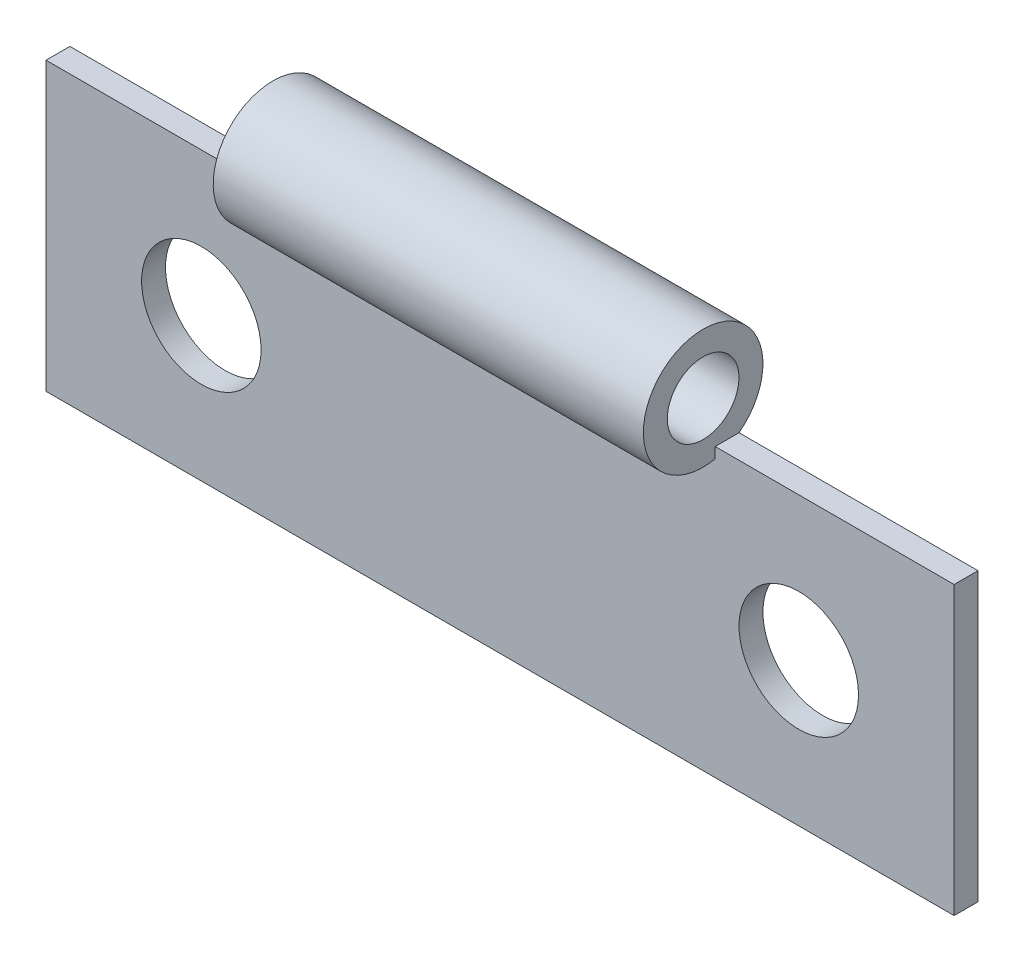
ISO-10303-21;
HEADER;
FILE_DESCRIPTION(('STEP AP214'),'2;1');
FILE_NAME('part.step','',(''),(''),'','','');
FILE_SCHEMA(('AUTOMOTIVE_DESIGN { 1 0 10303 214 1 1 1 1 }'));
ENDSEC;
DATA;
#1=APPLICATION_CONTEXT('core data for automotive mechanical design processes');
#2=APPLICATION_PROTOCOL_DEFINITION('international standard','automotive_design',2000,#1);
#3=PRODUCT_CONTEXT('',#1,'mechanical');
#4=PRODUCT('Part','Part','',(#3));
#5=PRODUCT_RELATED_PRODUCT_CATEGORY('part','',(#4));
#6=PRODUCT_DEFINITION_FORMATION('','',#4);
#7=PRODUCT_DEFINITION_CONTEXT('part definition',#1,'design');
#8=PRODUCT_DEFINITION('design','',#6,#7);
#9=PRODUCT_DEFINITION_SHAPE('','',#8);
#10=(LENGTH_UNIT() NAMED_UNIT(*) SI_UNIT(.MILLI.,.METRE.));
#11=(NAMED_UNIT(*) PLANE_ANGLE_UNIT() SI_UNIT($,.RADIAN.));
#12=(NAMED_UNIT(*) SI_UNIT($,.STERADIAN.) SOLID_ANGLE_UNIT());
#13=UNCERTAINTY_MEASURE_WITH_UNIT(LENGTH_MEASURE(1.E-05),#10,'distance_accuracy_value','');
#14=(GEOMETRIC_REPRESENTATION_CONTEXT(3) GLOBAL_UNCERTAINTY_ASSIGNED_CONTEXT((#13)) GLOBAL_UNIT_ASSIGNED_CONTEXT((#10,
#11,#12)) REPRESENTATION_CONTEXT('',''));
#15=CARTESIAN_POINT('',(0.,0.,0.));
#16=DIRECTION('',(0.,0.,1.));
#17=DIRECTION('',(1.,0.,0.));
#18=AXIS2_PLACEMENT_3D('',#15,#16,#17);
#19=CARTESIAN_POINT('',(0.,0.,1.));
#20=DIRECTION('',(0.,0.,-1.));
#21=DIRECTION('',(-1.,0.,0.));
#22=AXIS2_PLACEMENT_3D('',#19,#20,#21);
#23=PLANE('',#22);
#24=CARTESIAN_POINT('',(-12.5,0.,1.));
#25=DIRECTION('',(0.,0.,1.));
#26=DIRECTION('',(1.,0.,0.));
#27=AXIS2_PLACEMENT_3D('',#24,#25,#26);
#28=CIRCLE('',#27,2.5);
#29=CARTESIAN_POINT('',(-10.,0.,1.));
#30=VERTEX_POINT('',#29);
#31=EDGE_CURVE('E120',#30,#30,#28,.T.);
#32=ORIENTED_EDGE('',*,*,#31,.F.);
#33=EDGE_LOOP('',(#32));
#34=FACE_BOUND('',#33,.T.);
#35=CARTESIAN_POINT('',(12.5,0.,1.));
#36=DIRECTION('',(0.,0.,1.));
#37=DIRECTION('',(1.,0.,0.));
#38=AXIS2_PLACEMENT_3D('',#35,#36,#37);
#39=CIRCLE('',#38,2.5);
#40=CARTESIAN_POINT('',(15.,0.,1.));
#41=VERTEX_POINT('',#40);
#42=EDGE_CURVE('E127',#41,#41,#39,.T.);
#43=ORIENTED_EDGE('',*,*,#42,.F.);
#44=EDGE_LOOP('',(#43));
#45=FACE_BOUND('',#44,.T.);
#46=DIRECTION('',(0.,1.,0.));
#47=VECTOR('',#46,1.);
#48=CARTESIAN_POINT('',(9.,0.,1.));
#49=LINE('',#48,#47);
#50=CARTESIAN_POINT('',(9.,5.55084963734132,1.));
#51=VERTEX_POINT('',#50);
#52=CARTESIAN_POINT('',(9.,6.,1.));
#53=VERTEX_POINT('',#52);
#54=EDGE_CURVE('E105',#51,#53,#49,.T.);
#55=ORIENTED_EDGE('',*,*,#54,.F.);
#56=DIRECTION('',(-1.,0.,0.));
#57=VECTOR('',#56,1.);
#58=CARTESIAN_POINT('',(9.,5.55084963734132,1.));
#59=LINE('',#58,#57);
#60=CARTESIAN_POINT('',(-9.,5.55084963734132,1.));
#61=VERTEX_POINT('',#60);
#62=EDGE_CURVE('E111',#51,#61,#59,.T.);
#63=ORIENTED_EDGE('',*,*,#62,.T.);
#64=DIRECTION('',(0.,1.,0.));
#65=VECTOR('',#64,1.);
#66=CARTESIAN_POINT('',(-9.,0.,1.));
#67=LINE('',#66,#65);
#68=CARTESIAN_POINT('',(-9.,6.,1.));
#69=VERTEX_POINT('',#68);
#70=EDGE_CURVE('E99',#61,#69,#67,.T.);
#71=ORIENTED_EDGE('',*,*,#70,.T.);
#72=DIRECTION('',(-1.,0.,0.));
#73=VECTOR('',#72,1.);
#74=CARTESIAN_POINT('',(-19.,6.,1.));
#75=LINE('',#74,#73);
#76=CARTESIAN_POINT('',(-19.,6.,1.));
#77=VERTEX_POINT('',#76);
#78=EDGE_CURVE('E135',#69,#77,#75,.T.);
#79=ORIENTED_EDGE('',*,*,#78,.T.);
#80=DIRECTION('',(0.,-1.,0.));
#81=VECTOR('',#80,1.);
#82=CARTESIAN_POINT('',(-19.,-6.,1.));
#83=LINE('',#82,#81);
#84=CARTESIAN_POINT('',(-19.,-6.,1.));
#85=VERTEX_POINT('',#84);
#86=EDGE_CURVE('E137',#77,#85,#83,.T.);
#87=ORIENTED_EDGE('',*,*,#86,.T.);
#88=DIRECTION('',(1.,0.,0.));
#89=VECTOR('',#88,1.);
#90=CARTESIAN_POINT('',(-19.,-6.,1.));
#91=LINE('',#90,#89);
#92=CARTESIAN_POINT('',(19.,-6.,1.));
#93=VERTEX_POINT('',#92);
#94=EDGE_CURVE('E56',#85,#93,#91,.T.);
#95=ORIENTED_EDGE('',*,*,#94,.T.);
#96=DIRECTION('',(0.,1.,0.));
#97=VECTOR('',#96,1.);
#98=CARTESIAN_POINT('',(19.,-6.,1.));
#99=LINE('',#98,#97);
#100=CARTESIAN_POINT('',(19.,6.,1.));
#101=VERTEX_POINT('',#100);
#102=EDGE_CURVE('E133',#93,#101,#99,.T.);
#103=ORIENTED_EDGE('',*,*,#102,.T.);
#104=EDGE_CURVE('E85',#101,#53,#75,.T.);
#105=ORIENTED_EDGE('',*,*,#104,.T.);
#106=EDGE_LOOP('',(#55,#63,#71,#79,#87,#95,#103,#105));
#107=FACE_BOUND('',#106,.T.);
#108=ADVANCED_FACE('F32',(#34,#45,#107),#23,.F.);
#109=CARTESIAN_POINT('',(-19.,6.,1.));
#110=DIRECTION('',(0.,-1.,0.));
#111=DIRECTION('',(0.,0.,-1.));
#112=AXIS2_PLACEMENT_3D('',#109,#110,#111);
#113=PLANE('',#112);
#114=DIRECTION('',(0.,0.,-1.));
#115=VECTOR('',#114,1.);
#116=CARTESIAN_POINT('',(9.,6.,1.));
#117=LINE('',#116,#115);
#118=CARTESIAN_POINT('',(9.,6.,0.00123140658122851));
#119=VERTEX_POINT('',#118);
#120=EDGE_CURVE('E11',#53,#119,#117,.T.);
#121=ORIENTED_EDGE('',*,*,#120,.F.);
#122=ORIENTED_EDGE('',*,*,#104,.F.);
#123=DIRECTION('',(0.,0.,-1.));
#124=VECTOR('',#123,1.);
#125=CARTESIAN_POINT('',(19.,6.,1.));
#126=LINE('',#125,#124);
#127=CARTESIAN_POINT('',(19.,6.,0.));
#128=VERTEX_POINT('',#127);
#129=EDGE_CURVE('E154',#101,#128,#126,.T.);
#130=ORIENTED_EDGE('',*,*,#129,.T.);
#131=DIRECTION('',(-1.,0.,0.));
#132=VECTOR('',#131,1.);
#133=CARTESIAN_POINT('',(-19.,6.,0.));
#134=LINE('',#133,#132);
#135=CARTESIAN_POINT('',(-19.,6.,0.));
#136=VERTEX_POINT('',#135);
#137=EDGE_CURVE('E143',#128,#136,#134,.T.);
#138=ORIENTED_EDGE('',*,*,#137,.T.);
#139=DIRECTION('',(0.,0.,-1.));
#140=VECTOR('',#139,1.);
#141=CARTESIAN_POINT('',(-19.,6.,1.));
#142=LINE('',#141,#140);
#143=EDGE_CURVE('E151',#77,#136,#142,.T.);
#144=ORIENTED_EDGE('',*,*,#143,.F.);
#145=ORIENTED_EDGE('',*,*,#78,.F.);
#146=DIRECTION('',(0.,0.,-1.));
#147=VECTOR('',#146,1.);
#148=CARTESIAN_POINT('',(-9.,6.,1.));
#149=LINE('',#148,#147);
#150=CARTESIAN_POINT('',(-9.,6.,0.00123140658122851));
#151=VERTEX_POINT('',#150);
#152=EDGE_CURVE('E102',#69,#151,#149,.T.);
#153=ORIENTED_EDGE('',*,*,#152,.T.);
#154=DIRECTION('',(-1.,0.,0.));
#155=VECTOR('',#154,1.);
#156=CARTESIAN_POINT('',(9.,6.,0.00123140658122851));
#157=LINE('',#156,#155);
#158=EDGE_CURVE('E40',#151,#119,#157,.F.);
#159=ORIENTED_EDGE('',*,*,#158,.T.);
#160=EDGE_LOOP('',(#121,#122,#130,#138,#144,#145,#153,#159));
#161=FACE_BOUND('',#160,.T.);
#162=ADVANCED_FACE('F156',(#161),#113,.F.);
#163=CARTESIAN_POINT('',(0.,0.,0.));
#164=DIRECTION('',(0.,0.,-1.));
#165=DIRECTION('',(-1.,0.,0.));
#166=AXIS2_PLACEMENT_3D('',#163,#164,#165);
#167=PLANE('',#166);
#168=CARTESIAN_POINT('',(12.5,0.,0.));
#169=DIRECTION('',(0.,0.,1.));
#170=DIRECTION('',(1.,0.,0.));
#171=AXIS2_PLACEMENT_3D('',#168,#169,#170);
#172=CIRCLE('',#171,2.5);
#173=CARTESIAN_POINT('',(15.,0.,0.));
#174=VERTEX_POINT('',#173);
#175=EDGE_CURVE('E125',#174,#174,#172,.T.);
#176=ORIENTED_EDGE('',*,*,#175,.T.);
#177=EDGE_LOOP('',(#176));
#178=FACE_BOUND('',#177,.T.);
#179=DIRECTION('',(0.,1.,0.));
#180=VECTOR('',#179,1.);
#181=CARTESIAN_POINT('',(19.,-6.,0.));
#182=LINE('',#181,#180);
#183=CARTESIAN_POINT('',(19.,-6.,0.));
#184=VERTEX_POINT('',#183);
#185=EDGE_CURVE('E130',#184,#128,#182,.T.);
#186=ORIENTED_EDGE('',*,*,#185,.F.);
#187=DIRECTION('',(1.,0.,0.));
#188=VECTOR('',#187,1.);
#189=CARTESIAN_POINT('',(-19.,-6.,0.));
#190=LINE('',#189,#188);
#191=CARTESIAN_POINT('',(-19.,-6.,0.));
#192=VERTEX_POINT('',#191);
#193=EDGE_CURVE('E77',#192,#184,#190,.T.);
#194=ORIENTED_EDGE('',*,*,#193,.F.);
#195=DIRECTION('',(0.,-1.,0.));
#196=VECTOR('',#195,1.);
#197=CARTESIAN_POINT('',(-19.,-6.,0.));
#198=LINE('',#197,#196);
#199=EDGE_CURVE('E145',#136,#192,#198,.T.);
#200=ORIENTED_EDGE('',*,*,#199,.F.);
#201=ORIENTED_EDGE('',*,*,#137,.F.);
#202=EDGE_LOOP('',(#186,#194,#200,#201));
#203=FACE_BOUND('',#202,.T.);
#204=CARTESIAN_POINT('',(-12.5,0.,0.));
#205=DIRECTION('',(0.,0.,1.));
#206=DIRECTION('',(1.,0.,0.));
#207=AXIS2_PLACEMENT_3D('',#204,#205,#206);
#208=CIRCLE('',#207,2.5);
#209=CARTESIAN_POINT('',(-10.,0.,0.));
#210=VERTEX_POINT('',#209);
#211=EDGE_CURVE('E117',#210,#210,#208,.T.);
#212=ORIENTED_EDGE('',*,*,#211,.T.);
#213=EDGE_LOOP('',(#212));
#214=FACE_BOUND('',#213,.T.);
#215=ADVANCED_FACE('F169',(#178,#203,#214),#167,.T.);
#216=CARTESIAN_POINT('',(19.,-6.,1.));
#217=DIRECTION('',(-1.,0.,0.));
#218=DIRECTION('',(0.,0.,1.));
#219=AXIS2_PLACEMENT_3D('',#216,#217,#218);
#220=PLANE('',#219);
#221=ORIENTED_EDGE('',*,*,#185,.T.);
#222=ORIENTED_EDGE('',*,*,#129,.F.);
#223=ORIENTED_EDGE('',*,*,#102,.F.);
#224=DIRECTION('',(0.,0.,-1.));
#225=VECTOR('',#224,1.);
#226=CARTESIAN_POINT('',(19.,-6.,1.));
#227=LINE('',#226,#225);
#228=EDGE_CURVE('E140',#93,#184,#227,.T.);
#229=ORIENTED_EDGE('',*,*,#228,.T.);
#230=EDGE_LOOP('',(#221,#222,#223,#229));
#231=FACE_BOUND('',#230,.T.);
#232=ADVANCED_FACE('F34',(#231),#220,.F.);
#233=CARTESIAN_POINT('',(-19.,-6.,1.));
#234=DIRECTION('',(1.,0.,0.));
#235=DIRECTION('',(0.,0.,-1.));
#236=AXIS2_PLACEMENT_3D('',#233,#234,#235);
#237=PLANE('',#236);
#238=ORIENTED_EDGE('',*,*,#199,.T.);
#239=DIRECTION('',(0.,0.,-1.));
#240=VECTOR('',#239,1.);
#241=CARTESIAN_POINT('',(-19.,-6.,1.));
#242=LINE('',#241,#240);
#243=EDGE_CURVE('E149',#85,#192,#242,.T.);
#244=ORIENTED_EDGE('',*,*,#243,.F.);
#245=ORIENTED_EDGE('',*,*,#86,.F.);
#246=ORIENTED_EDGE('',*,*,#143,.T.);
#247=EDGE_LOOP('',(#238,#244,#245,#246));
#248=FACE_BOUND('',#247,.T.);
#249=ADVANCED_FACE('F161',(#248),#237,.F.);
#250=CARTESIAN_POINT('',(-19.,-6.,1.));
#251=DIRECTION('',(0.,1.,0.));
#252=DIRECTION('',(0.,0.,1.));
#253=AXIS2_PLACEMENT_3D('',#250,#251,#252);
#254=PLANE('',#253);
#255=ORIENTED_EDGE('',*,*,#193,.T.);
#256=ORIENTED_EDGE('',*,*,#228,.F.);
#257=ORIENTED_EDGE('',*,*,#94,.F.);
#258=ORIENTED_EDGE('',*,*,#243,.T.);
#259=EDGE_LOOP('',(#255,#256,#257,#258));
#260=FACE_BOUND('',#259,.T.);
#261=ADVANCED_FACE('F163',(#260),#254,.F.);
#262=CARTESIAN_POINT('',(12.5,0.,1.));
#263=DIRECTION('',(0.,0.,-1.));
#264=DIRECTION('',(-1.,0.,0.));
#265=AXIS2_PLACEMENT_3D('',#262,#263,#264);
#266=CYLINDRICAL_SURFACE('',#265,2.5);
#267=ORIENTED_EDGE('',*,*,#42,.T.);
#268=EDGE_LOOP('',(#267));
#269=FACE_BOUND('',#268,.T.);
#270=ORIENTED_EDGE('',*,*,#175,.F.);
#271=EDGE_LOOP('',(#270));
#272=FACE_BOUND('',#271,.T.);
#273=ADVANCED_FACE('F178',(#269,#272),#266,.F.);
#274=CARTESIAN_POINT('',(-12.5,0.,1.));
#275=DIRECTION('',(0.,0.,-1.));
#276=DIRECTION('',(-1.,0.,0.));
#277=AXIS2_PLACEMENT_3D('',#274,#275,#276);
#278=CYLINDRICAL_SURFACE('',#277,2.5);
#279=ORIENTED_EDGE('',*,*,#31,.T.);
#280=EDGE_LOOP('',(#279));
#281=FACE_BOUND('',#280,.T.);
#282=ORIENTED_EDGE('',*,*,#211,.F.);
#283=EDGE_LOOP('',(#282));
#284=FACE_BOUND('',#283,.T.);
#285=ADVANCED_FACE('F176',(#281,#284),#278,.F.);
#286=CARTESIAN_POINT('',(9.,8.00184692044318,1.50184692044318));
#287=DIRECTION('',(-1.,0.,0.));
#288=DIRECTION('',(0.,0.,1.));
#289=AXIS2_PLACEMENT_3D('',#286,#287,#288);
#290=CYLINDRICAL_SURFACE('',#289,2.50184692044318);
#291=ORIENTED_EDGE('',*,*,#62,.F.);
#292=CARTESIAN_POINT('',(9.,8.00184692044318,1.50184692044318));
#293=DIRECTION('',(-1.,0.,0.));
#294=DIRECTION('',(0.,0.,1.));
#295=AXIS2_PLACEMENT_3D('',#292,#293,#294);
#296=CIRCLE('',#295,2.50184692044318);
#297=EDGE_CURVE('E106',#51,#119,#296,.T.);
#298=ORIENTED_EDGE('',*,*,#297,.T.);
#299=ORIENTED_EDGE('',*,*,#158,.F.);
#300=CARTESIAN_POINT('',(-9.,8.00184692044318,1.50184692044318));
#301=DIRECTION('',(-1.,0.,0.));
#302=DIRECTION('',(0.,0.,1.));
#303=AXIS2_PLACEMENT_3D('',#300,#301,#302);
#304=CIRCLE('',#303,2.50184692044318);
#305=EDGE_CURVE('E47',#61,#151,#304,.T.);
#306=ORIENTED_EDGE('',*,*,#305,.F.);
#307=EDGE_LOOP('',(#291,#298,#299,#306));
#308=FACE_BOUND('',#307,.T.);
#309=ADVANCED_FACE('F109',(#308),#290,.T.);
#310=CARTESIAN_POINT('',(9.,8.00184692044318,1.50184692044318));
#311=DIRECTION('',(-1.,0.,0.));
#312=DIRECTION('',(0.,0.,1.));
#313=AXIS2_PLACEMENT_3D('',#310,#311,#312);
#314=PLANE('',#313);
#315=CARTESIAN_POINT('',(9.,8.00184692044318,1.50184692044318));
#316=DIRECTION('',(-1.,0.,0.));
#317=DIRECTION('',(0.,0.,1.));
#318=AXIS2_PLACEMENT_3D('',#315,#316,#317);
#319=CIRCLE('',#318,1.5);
#320=CARTESIAN_POINT('',(9.,8.00184692044318,3.00184692044318));
#321=VERTEX_POINT('',#320);
#322=EDGE_CURVE('E114',#321,#321,#319,.T.);
#323=ORIENTED_EDGE('',*,*,#322,.T.);
#324=EDGE_LOOP('',(#323));
#325=FACE_BOUND('',#324,.T.);
#326=ORIENTED_EDGE('',*,*,#297,.F.);
#327=ORIENTED_EDGE('',*,*,#54,.T.);
#328=ORIENTED_EDGE('',*,*,#120,.T.);
#329=EDGE_LOOP('',(#326,#327,#328));
#330=FACE_BOUND('',#329,.T.);
#331=ADVANCED_FACE('F186',(#325,#330),#314,.F.);
#332=CARTESIAN_POINT('',(-9.,8.00184692044318,1.50184692044318));
#333=DIRECTION('',(-1.,0.,0.));
#334=DIRECTION('',(0.,0.,1.));
#335=AXIS2_PLACEMENT_3D('',#332,#333,#334);
#336=PLANE('',#335);
#337=CARTESIAN_POINT('',(-9.,8.00184692044318,1.50184692044318));
#338=DIRECTION('',(-1.,0.,0.));
#339=DIRECTION('',(0.,0.,1.));
#340=AXIS2_PLACEMENT_3D('',#337,#338,#339);
#341=CIRCLE('',#340,1.5);
#342=CARTESIAN_POINT('',(-9.,8.00184692044318,3.00184692044318));
#343=VERTEX_POINT('',#342);
#344=EDGE_CURVE('E283',#343,#343,#341,.T.);
#345=ORIENTED_EDGE('',*,*,#344,.F.);
#346=EDGE_LOOP('',(#345));
#347=FACE_BOUND('',#346,.T.);
#348=ORIENTED_EDGE('',*,*,#70,.F.);
#349=ORIENTED_EDGE('',*,*,#305,.T.);
#350=ORIENTED_EDGE('',*,*,#152,.F.);
#351=EDGE_LOOP('',(#348,#349,#350));
#352=FACE_BOUND('',#351,.T.);
#353=ADVANCED_FACE('F100',(#347,#352),#336,.T.);
#354=CARTESIAN_POINT('',(9.,8.00184692044318,1.50184692044318));
#355=DIRECTION('',(-1.,0.,0.));
#356=DIRECTION('',(0.,0.,1.));
#357=AXIS2_PLACEMENT_3D('',#354,#355,#356);
#358=CYLINDRICAL_SURFACE('',#357,1.5);
#359=ORIENTED_EDGE('',*,*,#322,.F.);
#360=EDGE_LOOP('',(#359));
#361=FACE_BOUND('',#360,.T.);
#362=ORIENTED_EDGE('',*,*,#344,.T.);
#363=EDGE_LOOP('',(#362));
#364=FACE_BOUND('',#363,.T.);
#365=ADVANCED_FACE('F263',(#361,#364),#358,.F.);
#366=CLOSED_SHELL('',(#108,#162,#215,#232,#249,#261,#273,#285,#309,#331,#353,#365));
#367=MANIFOLD_SOLID_BREP('B2',#366);
#368=ADVANCED_BREP_SHAPE_REPRESENTATION('',(#18,#367),#14);
#369=SHAPE_DEFINITION_REPRESENTATION(#9,#368);
ENDSEC;
END-ISO-10303-21;
